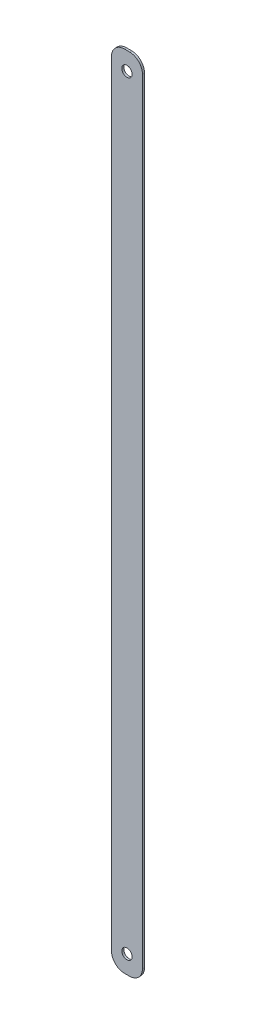
ISO-10303-21;
HEADER;
FILE_DESCRIPTION(('STEP AP214'),'2;1');
FILE_NAME('part.step','',(''),(''),'','','');
FILE_SCHEMA(('AUTOMOTIVE_DESIGN { 1 0 10303 214 1 1 1 1 }'));
ENDSEC;
DATA;
#1=APPLICATION_CONTEXT('core data for automotive mechanical design processes');
#2=APPLICATION_PROTOCOL_DEFINITION('international standard','automotive_design',2000,#1);
#3=PRODUCT_CONTEXT('',#1,'mechanical');
#4=PRODUCT('Part','Part','',(#3));
#5=PRODUCT_RELATED_PRODUCT_CATEGORY('part','',(#4));
#6=PRODUCT_DEFINITION_FORMATION('','',#4);
#7=PRODUCT_DEFINITION_CONTEXT('part definition',#1,'design');
#8=PRODUCT_DEFINITION('design','',#6,#7);
#9=PRODUCT_DEFINITION_SHAPE('','',#8);
#10=(LENGTH_UNIT() NAMED_UNIT(*) SI_UNIT(.MILLI.,.METRE.));
#11=(NAMED_UNIT(*) PLANE_ANGLE_UNIT() SI_UNIT($,.RADIAN.));
#12=(NAMED_UNIT(*) SI_UNIT($,.STERADIAN.) SOLID_ANGLE_UNIT());
#13=UNCERTAINTY_MEASURE_WITH_UNIT(LENGTH_MEASURE(1.E-05),#10,'distance_accuracy_value','');
#14=(GEOMETRIC_REPRESENTATION_CONTEXT(3) GLOBAL_UNCERTAINTY_ASSIGNED_CONTEXT((#13)) GLOBAL_UNIT_ASSIGNED_CONTEXT((#10,
#11,#12)) REPRESENTATION_CONTEXT('',''));
#15=CARTESIAN_POINT('',(0.,0.,0.));
#16=DIRECTION('',(0.,0.,1.));
#17=DIRECTION('',(1.,0.,0.));
#18=AXIS2_PLACEMENT_3D('',#15,#16,#17);
#19=CARTESIAN_POINT('',(0.999999999999999,-150.,0.4));
#20=DIRECTION('',(0.,0.,1.));
#21=DIRECTION('',(1.,0.,0.));
#22=AXIS2_PLACEMENT_3D('',#19,#20,#21);
#23=PLANE('',#22);
#24=CARTESIAN_POINT('',(0.,148.,0.4));
#25=DIRECTION('',(0.,0.,1.));
#26=DIRECTION('',(1.,0.,0.));
#27=AXIS2_PLACEMENT_3D('',#24,#25,#26);
#28=CIRCLE('',#27,2.);
#29=CARTESIAN_POINT('',(2.,148.,0.4));
#30=VERTEX_POINT('',#29);
#31=EDGE_CURVE('E146',#30,#30,#28,.T.);
#32=ORIENTED_EDGE('',*,*,#31,.F.);
#33=EDGE_LOOP('',(#32));
#34=FACE_BOUND('',#33,.T.);
#35=CARTESIAN_POINT('',(0.999999999999999,-150.,0.4));
#36=DIRECTION('',(0.,0.,1.));
#37=DIRECTION('',(1.,0.,0.));
#38=AXIS2_PLACEMENT_3D('',#35,#36,#37);
#39=CIRCLE('',#38,5.);
#40=CARTESIAN_POINT('',(0.999999999999963,-155.,0.4));
#41=VERTEX_POINT('',#40);
#42=CARTESIAN_POINT('',(6.,-150.,0.4));
#43=VERTEX_POINT('',#42);
#44=EDGE_CURVE('E164',#41,#43,#39,.T.);
#45=ORIENTED_EDGE('',*,*,#44,.T.);
#46=DIRECTION('',(0.,1.,0.));
#47=VECTOR('',#46,1.);
#48=CARTESIAN_POINT('',(6.,-150.,0.4));
#49=LINE('',#48,#47);
#50=CARTESIAN_POINT('',(6.,150.,0.4));
#51=VERTEX_POINT('',#50);
#52=EDGE_CURVE('E100',#43,#51,#49,.T.);
#53=ORIENTED_EDGE('',*,*,#52,.T.);
#54=CARTESIAN_POINT('',(0.999999999999999,150.,0.4));
#55=DIRECTION('',(0.,0.,1.));
#56=DIRECTION('',(-1.,0.,0.));
#57=AXIS2_PLACEMENT_3D('',#54,#55,#56);
#58=CIRCLE('',#57,5.);
#59=CARTESIAN_POINT('',(0.999999999999963,155.,0.4));
#60=VERTEX_POINT('',#59);
#61=EDGE_CURVE('E185',#51,#60,#58,.T.);
#62=ORIENTED_EDGE('',*,*,#61,.T.);
#63=DIRECTION('',(-1.,0.,0.));
#64=VECTOR('',#63,1.);
#65=CARTESIAN_POINT('',(-0.999999999999967,155.,0.4));
#66=LINE('',#65,#64);
#67=CARTESIAN_POINT('',(-0.999999999999967,155.,0.4));
#68=VERTEX_POINT('',#67);
#69=EDGE_CURVE('E199',#60,#68,#66,.T.);
#70=ORIENTED_EDGE('',*,*,#69,.T.);
#71=CARTESIAN_POINT('',(-1.,150.,0.4));
#72=DIRECTION('',(0.,0.,1.));
#73=DIRECTION('',(-1.,0.,0.));
#74=AXIS2_PLACEMENT_3D('',#71,#72,#73);
#75=CIRCLE('',#74,5.);
#76=CARTESIAN_POINT('',(-6.,150.,0.4));
#77=VERTEX_POINT('',#76);
#78=EDGE_CURVE('E119',#68,#77,#75,.T.);
#79=ORIENTED_EDGE('',*,*,#78,.T.);
#80=DIRECTION('',(0.,-1.,0.));
#81=VECTOR('',#80,1.);
#82=CARTESIAN_POINT('',(-6.,-150.,0.4));
#83=LINE('',#82,#81);
#84=CARTESIAN_POINT('',(-6.,-150.,0.4));
#85=VERTEX_POINT('',#84);
#86=EDGE_CURVE('E113',#77,#85,#83,.T.);
#87=ORIENTED_EDGE('',*,*,#86,.T.);
#88=CARTESIAN_POINT('',(-1.,-150.,0.4));
#89=DIRECTION('',(0.,0.,1.));
#90=DIRECTION('',(-1.,0.,0.));
#91=AXIS2_PLACEMENT_3D('',#88,#89,#90);
#92=CIRCLE('',#91,5.);
#93=CARTESIAN_POINT('',(-0.999999999999967,-155.,0.4));
#94=VERTEX_POINT('',#93);
#95=EDGE_CURVE('E117',#85,#94,#92,.T.);
#96=ORIENTED_EDGE('',*,*,#95,.T.);
#97=DIRECTION('',(1.,0.,0.));
#98=VECTOR('',#97,1.);
#99=CARTESIAN_POINT('',(-0.999999999999967,-155.,0.4));
#100=LINE('',#99,#98);
#101=EDGE_CURVE('E57',#94,#41,#100,.T.);
#102=ORIENTED_EDGE('',*,*,#101,.T.);
#103=EDGE_LOOP('',(#45,#53,#62,#70,#79,#87,#96,#102));
#104=FACE_BOUND('',#103,.T.);
#105=CARTESIAN_POINT('',(0.,-148.,0.4));
#106=DIRECTION('',(0.,0.,1.));
#107=DIRECTION('',(-1.,0.,0.));
#108=AXIS2_PLACEMENT_3D('',#105,#106,#107);
#109=CIRCLE('',#108,2.);
#110=CARTESIAN_POINT('',(-2.,-148.,0.4));
#111=VERTEX_POINT('',#110);
#112=EDGE_CURVE('E213',#111,#111,#109,.T.);
#113=ORIENTED_EDGE('',*,*,#112,.F.);
#114=EDGE_LOOP('',(#113));
#115=FACE_BOUND('',#114,.T.);
#116=ADVANCED_FACE('F39',(#34,#104,#115),#23,.T.);
#117=CARTESIAN_POINT('',(0.999999999999999,-150.,-0.4));
#118=DIRECTION('',(0.,0.,1.));
#119=DIRECTION('',(1.,0.,0.));
#120=AXIS2_PLACEMENT_3D('',#117,#118,#119);
#121=PLANE('',#120);
#122=CARTESIAN_POINT('',(0.999999999999999,-150.,-0.4));
#123=DIRECTION('',(0.,0.,1.));
#124=DIRECTION('',(1.,0.,0.));
#125=AXIS2_PLACEMENT_3D('',#122,#123,#124);
#126=CIRCLE('',#125,5.);
#127=CARTESIAN_POINT('',(0.999999999999963,-155.,-0.4));
#128=VERTEX_POINT('',#127);
#129=CARTESIAN_POINT('',(6.,-150.,-0.4));
#130=VERTEX_POINT('',#129);
#131=EDGE_CURVE('E141',#128,#130,#126,.T.);
#132=ORIENTED_EDGE('',*,*,#131,.F.);
#133=DIRECTION('',(1.,0.,0.));
#134=VECTOR('',#133,1.);
#135=CARTESIAN_POINT('',(-0.999999999999967,-155.,-0.4));
#136=LINE('',#135,#134);
#137=CARTESIAN_POINT('',(-0.999999999999967,-155.,-0.4));
#138=VERTEX_POINT('',#137);
#139=EDGE_CURVE('E92',#138,#128,#136,.T.);
#140=ORIENTED_EDGE('',*,*,#139,.F.);
#141=CARTESIAN_POINT('',(-1.,-150.,-0.4));
#142=DIRECTION('',(0.,0.,1.));
#143=DIRECTION('',(-1.,0.,0.));
#144=AXIS2_PLACEMENT_3D('',#141,#142,#143);
#145=CIRCLE('',#144,5.);
#146=CARTESIAN_POINT('',(-6.,-150.,-0.4));
#147=VERTEX_POINT('',#146);
#148=EDGE_CURVE('E86',#147,#138,#145,.T.);
#149=ORIENTED_EDGE('',*,*,#148,.F.);
#150=DIRECTION('',(0.,-1.,0.));
#151=VECTOR('',#150,1.);
#152=CARTESIAN_POINT('',(-6.,-150.,-0.4));
#153=LINE('',#152,#151);
#154=CARTESIAN_POINT('',(-6.,150.,-0.4));
#155=VERTEX_POINT('',#154);
#156=EDGE_CURVE('E128',#155,#147,#153,.T.);
#157=ORIENTED_EDGE('',*,*,#156,.F.);
#158=CARTESIAN_POINT('',(-1.,150.,-0.4));
#159=DIRECTION('',(0.,0.,1.));
#160=DIRECTION('',(-1.,0.,0.));
#161=AXIS2_PLACEMENT_3D('',#158,#159,#160);
#162=CIRCLE('',#161,5.);
#163=CARTESIAN_POINT('',(-0.999999999999967,155.,-0.4));
#164=VERTEX_POINT('',#163);
#165=EDGE_CURVE('E155',#164,#155,#162,.T.);
#166=ORIENTED_EDGE('',*,*,#165,.F.);
#167=DIRECTION('',(-1.,0.,0.));
#168=VECTOR('',#167,1.);
#169=CARTESIAN_POINT('',(-0.999999999999967,155.,-0.4));
#170=LINE('',#169,#168);
#171=CARTESIAN_POINT('',(0.999999999999963,155.,-0.4));
#172=VERTEX_POINT('',#171);
#173=EDGE_CURVE('E152',#172,#164,#170,.T.);
#174=ORIENTED_EDGE('',*,*,#173,.F.);
#175=CARTESIAN_POINT('',(0.999999999999999,150.,-0.4));
#176=DIRECTION('',(0.,0.,1.));
#177=DIRECTION('',(-1.,0.,0.));
#178=AXIS2_PLACEMENT_3D('',#175,#176,#177);
#179=CIRCLE('',#178,5.);
#180=CARTESIAN_POINT('',(6.,150.,-0.4));
#181=VERTEX_POINT('',#180);
#182=EDGE_CURVE('E149',#181,#172,#179,.T.);
#183=ORIENTED_EDGE('',*,*,#182,.F.);
#184=DIRECTION('',(0.,1.,0.));
#185=VECTOR('',#184,1.);
#186=CARTESIAN_POINT('',(6.,-150.,-0.4));
#187=LINE('',#186,#185);
#188=EDGE_CURVE('E145',#130,#181,#187,.T.);
#189=ORIENTED_EDGE('',*,*,#188,.F.);
#190=EDGE_LOOP('',(#132,#140,#149,#157,#166,#174,#183,#189));
#191=FACE_BOUND('',#190,.T.);
#192=CARTESIAN_POINT('',(0.,148.,-0.4));
#193=DIRECTION('',(0.,0.,1.));
#194=DIRECTION('',(1.,0.,0.));
#195=AXIS2_PLACEMENT_3D('',#192,#193,#194);
#196=CIRCLE('',#195,2.);
#197=CARTESIAN_POINT('',(2.,148.,-0.4));
#198=VERTEX_POINT('',#197);
#199=EDGE_CURVE('E209',#198,#198,#196,.T.);
#200=ORIENTED_EDGE('',*,*,#199,.T.);
#201=EDGE_LOOP('',(#200));
#202=FACE_BOUND('',#201,.T.);
#203=CARTESIAN_POINT('',(0.,-148.,-0.4));
#204=DIRECTION('',(0.,0.,1.));
#205=DIRECTION('',(-1.,0.,0.));
#206=AXIS2_PLACEMENT_3D('',#203,#204,#205);
#207=CIRCLE('',#206,2.);
#208=CARTESIAN_POINT('',(-2.,-148.,-0.4));
#209=VERTEX_POINT('',#208);
#210=EDGE_CURVE('E217',#209,#209,#207,.T.);
#211=ORIENTED_EDGE('',*,*,#210,.T.);
#212=EDGE_LOOP('',(#211));
#213=FACE_BOUND('',#212,.T.);
#214=ADVANCED_FACE('F189',(#191,#202,#213),#121,.F.);
#215=CARTESIAN_POINT('',(0.999999999999999,-150.,0.4));
#216=DIRECTION('',(0.,0.,-1.));
#217=DIRECTION('',(-1.,0.,0.));
#218=AXIS2_PLACEMENT_3D('',#215,#216,#217);
#219=CYLINDRICAL_SURFACE('',#218,5.);
#220=ORIENTED_EDGE('',*,*,#131,.T.);
#221=DIRECTION('',(0.,0.,-1.));
#222=VECTOR('',#221,1.);
#223=CARTESIAN_POINT('',(6.,-150.,0.4));
#224=LINE('',#223,#222);
#225=EDGE_CURVE('E11',#43,#130,#224,.T.);
#226=ORIENTED_EDGE('',*,*,#225,.F.);
#227=ORIENTED_EDGE('',*,*,#44,.F.);
#228=DIRECTION('',(0.,0.,-1.));
#229=VECTOR('',#228,1.);
#230=CARTESIAN_POINT('',(0.999999999999963,-155.,0.4));
#231=LINE('',#230,#229);
#232=EDGE_CURVE('E137',#41,#128,#231,.T.);
#233=ORIENTED_EDGE('',*,*,#232,.T.);
#234=EDGE_LOOP('',(#220,#226,#227,#233));
#235=FACE_BOUND('',#234,.T.);
#236=ADVANCED_FACE('F41',(#235),#219,.T.);
#237=CARTESIAN_POINT('',(6.,-150.,0.4));
#238=DIRECTION('',(-1.,0.,0.));
#239=DIRECTION('',(0.,0.,1.));
#240=AXIS2_PLACEMENT_3D('',#237,#238,#239);
#241=PLANE('',#240);
#242=ORIENTED_EDGE('',*,*,#188,.T.);
#243=DIRECTION('',(0.,0.,-1.));
#244=VECTOR('',#243,1.);
#245=CARTESIAN_POINT('',(6.,150.,0.4));
#246=LINE('',#245,#244);
#247=EDGE_CURVE('E49',#51,#181,#246,.T.);
#248=ORIENTED_EDGE('',*,*,#247,.F.);
#249=ORIENTED_EDGE('',*,*,#52,.F.);
#250=ORIENTED_EDGE('',*,*,#225,.T.);
#251=EDGE_LOOP('',(#242,#248,#249,#250));
#252=FACE_BOUND('',#251,.T.);
#253=ADVANCED_FACE('F251',(#252),#241,.F.);
#254=CARTESIAN_POINT('',(0.999999999999999,150.,0.4));
#255=DIRECTION('',(0.,0.,-1.));
#256=DIRECTION('',(-1.,0.,0.));
#257=AXIS2_PLACEMENT_3D('',#254,#255,#256);
#258=CYLINDRICAL_SURFACE('',#257,5.);
#259=ORIENTED_EDGE('',*,*,#182,.T.);
#260=DIRECTION('',(0.,0.,-1.));
#261=VECTOR('',#260,1.);
#262=CARTESIAN_POINT('',(0.999999999999963,155.,0.4));
#263=LINE('',#262,#261);
#264=EDGE_CURVE('E175',#60,#172,#263,.T.);
#265=ORIENTED_EDGE('',*,*,#264,.F.);
#266=ORIENTED_EDGE('',*,*,#61,.F.);
#267=ORIENTED_EDGE('',*,*,#247,.T.);
#268=EDGE_LOOP('',(#259,#265,#266,#267));
#269=FACE_BOUND('',#268,.T.);
#270=ADVANCED_FACE('F183',(#269),#258,.T.);
#271=CARTESIAN_POINT('',(-0.999999999999967,155.,0.4));
#272=DIRECTION('',(0.,-1.,0.));
#273=DIRECTION('',(0.,0.,-1.));
#274=AXIS2_PLACEMENT_3D('',#271,#272,#273);
#275=PLANE('',#274);
#276=ORIENTED_EDGE('',*,*,#173,.T.);
#277=DIRECTION('',(0.,0.,-1.));
#278=VECTOR('',#277,1.);
#279=CARTESIAN_POINT('',(-0.999999999999967,155.,0.4));
#280=LINE('',#279,#278);
#281=EDGE_CURVE('E171',#68,#164,#280,.T.);
#282=ORIENTED_EDGE('',*,*,#281,.F.);
#283=ORIENTED_EDGE('',*,*,#69,.F.);
#284=ORIENTED_EDGE('',*,*,#264,.T.);
#285=EDGE_LOOP('',(#276,#282,#283,#284));
#286=FACE_BOUND('',#285,.T.);
#287=ADVANCED_FACE('F194',(#286),#275,.F.);
#288=CARTESIAN_POINT('',(-1.,150.,0.4));
#289=DIRECTION('',(0.,0.,-1.));
#290=DIRECTION('',(-1.,0.,0.));
#291=AXIS2_PLACEMENT_3D('',#288,#289,#290);
#292=CYLINDRICAL_SURFACE('',#291,5.);
#293=ORIENTED_EDGE('',*,*,#165,.T.);
#294=DIRECTION('',(0.,0.,-1.));
#295=VECTOR('',#294,1.);
#296=CARTESIAN_POINT('',(-6.,150.,0.4));
#297=LINE('',#296,#295);
#298=EDGE_CURVE('E130',#77,#155,#297,.T.);
#299=ORIENTED_EDGE('',*,*,#298,.F.);
#300=ORIENTED_EDGE('',*,*,#78,.F.);
#301=ORIENTED_EDGE('',*,*,#281,.T.);
#302=EDGE_LOOP('',(#293,#299,#300,#301));
#303=FACE_BOUND('',#302,.T.);
#304=ADVANCED_FACE('F197',(#303),#292,.T.);
#305=CARTESIAN_POINT('',(-6.,-150.,0.4));
#306=DIRECTION('',(1.,0.,0.));
#307=DIRECTION('',(0.,0.,-1.));
#308=AXIS2_PLACEMENT_3D('',#305,#306,#307);
#309=PLANE('',#308);
#310=ORIENTED_EDGE('',*,*,#156,.T.);
#311=DIRECTION('',(0.,0.,-1.));
#312=VECTOR('',#311,1.);
#313=CARTESIAN_POINT('',(-6.,-150.,0.4));
#314=LINE('',#313,#312);
#315=EDGE_CURVE('E125',#85,#147,#314,.T.);
#316=ORIENTED_EDGE('',*,*,#315,.F.);
#317=ORIENTED_EDGE('',*,*,#86,.F.);
#318=ORIENTED_EDGE('',*,*,#298,.T.);
#319=EDGE_LOOP('',(#310,#316,#317,#318));
#320=FACE_BOUND('',#319,.T.);
#321=ADVANCED_FACE('F126',(#320),#309,.F.);
#322=CARTESIAN_POINT('',(-1.,-150.,0.4));
#323=DIRECTION('',(0.,0.,-1.));
#324=DIRECTION('',(-1.,0.,0.));
#325=AXIS2_PLACEMENT_3D('',#322,#323,#324);
#326=CYLINDRICAL_SURFACE('',#325,5.);
#327=ORIENTED_EDGE('',*,*,#148,.T.);
#328=DIRECTION('',(0.,0.,-1.));
#329=VECTOR('',#328,1.);
#330=CARTESIAN_POINT('',(-0.999999999999967,-155.,0.4));
#331=LINE('',#330,#329);
#332=EDGE_CURVE('E131',#94,#138,#331,.T.);
#333=ORIENTED_EDGE('',*,*,#332,.F.);
#334=ORIENTED_EDGE('',*,*,#95,.F.);
#335=ORIENTED_EDGE('',*,*,#315,.T.);
#336=EDGE_LOOP('',(#327,#333,#334,#335));
#337=FACE_BOUND('',#336,.T.);
#338=ADVANCED_FACE('F133',(#337),#326,.T.);
#339=CARTESIAN_POINT('',(-0.999999999999967,-155.,0.4));
#340=DIRECTION('',(0.,1.,0.));
#341=DIRECTION('',(0.,0.,1.));
#342=AXIS2_PLACEMENT_3D('',#339,#340,#341);
#343=PLANE('',#342);
#344=ORIENTED_EDGE('',*,*,#139,.T.);
#345=ORIENTED_EDGE('',*,*,#232,.F.);
#346=ORIENTED_EDGE('',*,*,#101,.F.);
#347=ORIENTED_EDGE('',*,*,#332,.T.);
#348=EDGE_LOOP('',(#344,#345,#346,#347));
#349=FACE_BOUND('',#348,.T.);
#350=ADVANCED_FACE('F239',(#349),#343,.F.);
#351=CARTESIAN_POINT('',(0.,148.,0.4));
#352=DIRECTION('',(0.,0.,-1.));
#353=DIRECTION('',(-1.,0.,0.));
#354=AXIS2_PLACEMENT_3D('',#351,#352,#353);
#355=CYLINDRICAL_SURFACE('',#354,2.);
#356=ORIENTED_EDGE('',*,*,#31,.T.);
#357=EDGE_LOOP('',(#356));
#358=FACE_BOUND('',#357,.T.);
#359=ORIENTED_EDGE('',*,*,#199,.F.);
#360=EDGE_LOOP('',(#359));
#361=FACE_BOUND('',#360,.T.);
#362=ADVANCED_FACE('F236',(#358,#361),#355,.F.);
#363=CARTESIAN_POINT('',(0.,-148.,0.4));
#364=DIRECTION('',(0.,0.,-1.));
#365=DIRECTION('',(-1.,0.,0.));
#366=AXIS2_PLACEMENT_3D('',#363,#364,#365);
#367=CYLINDRICAL_SURFACE('',#366,2.);
#368=ORIENTED_EDGE('',*,*,#112,.T.);
#369=EDGE_LOOP('',(#368));
#370=FACE_BOUND('',#369,.T.);
#371=ORIENTED_EDGE('',*,*,#210,.F.);
#372=EDGE_LOOP('',(#371));
#373=FACE_BOUND('',#372,.T.);
#374=ADVANCED_FACE('F225',(#370,#373),#367,.F.);
#375=CLOSED_SHELL('',(#116,#214,#236,#253,#270,#287,#304,#321,#338,#350,#362,#374));
#376=MANIFOLD_SOLID_BREP('B2',#375);
#377=ADVANCED_BREP_SHAPE_REPRESENTATION('',(#18,#376),#14);
#378=SHAPE_DEFINITION_REPRESENTATION(#9,#377);
ENDSEC;
END-ISO-10303-21;
